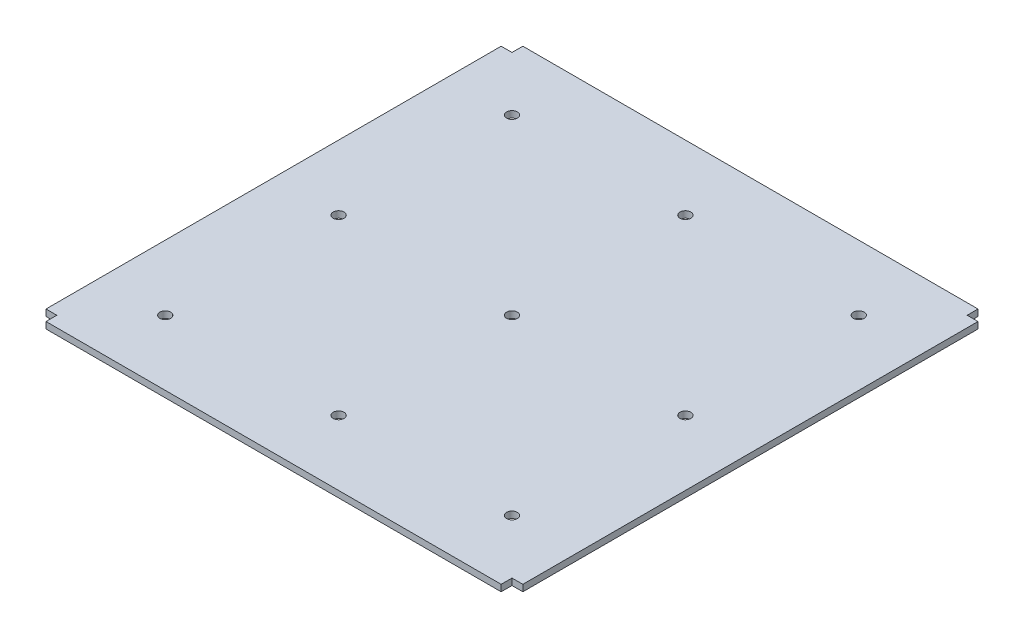
ISO-10303-21;
HEADER;
FILE_DESCRIPTION(('STEP AP214'),'2;1');
FILE_NAME('part.step','',(''),(''),'','','');
FILE_SCHEMA(('AUTOMOTIVE_DESIGN { 1 0 10303 214 1 1 1 1 }'));
ENDSEC;
DATA;
#1=APPLICATION_CONTEXT('core data for automotive mechanical design processes');
#2=APPLICATION_PROTOCOL_DEFINITION('international standard','automotive_design',2000,#1);
#3=PRODUCT_CONTEXT('',#1,'mechanical');
#4=PRODUCT('Part','Part','',(#3));
#5=PRODUCT_RELATED_PRODUCT_CATEGORY('part','',(#4));
#6=PRODUCT_DEFINITION_FORMATION('','',#4);
#7=PRODUCT_DEFINITION_CONTEXT('part definition',#1,'design');
#8=PRODUCT_DEFINITION('design','',#6,#7);
#9=PRODUCT_DEFINITION_SHAPE('','',#8);
#10=(LENGTH_UNIT() NAMED_UNIT(*) SI_UNIT(.MILLI.,.METRE.));
#11=(NAMED_UNIT(*) PLANE_ANGLE_UNIT() SI_UNIT($,.RADIAN.));
#12=(NAMED_UNIT(*) SI_UNIT($,.STERADIAN.) SOLID_ANGLE_UNIT());
#13=UNCERTAINTY_MEASURE_WITH_UNIT(LENGTH_MEASURE(1.E-05),#10,'distance_accuracy_value','');
#14=(GEOMETRIC_REPRESENTATION_CONTEXT(3) GLOBAL_UNCERTAINTY_ASSIGNED_CONTEXT((#13)) GLOBAL_UNIT_ASSIGNED_CONTEXT((#10,
#11,#12)) REPRESENTATION_CONTEXT('',''));
#15=CARTESIAN_POINT('',(0.,0.,0.));
#16=DIRECTION('',(0.,0.,1.));
#17=DIRECTION('',(1.,0.,0.));
#18=AXIS2_PLACEMENT_3D('',#15,#16,#17);
#19=CARTESIAN_POINT('',(0.,3.,-215.));
#20=DIRECTION('',(1.,0.,0.));
#21=DIRECTION('',(0.,0.,-1.));
#22=AXIS2_PLACEMENT_3D('',#19,#20,#21);
#23=PLANE('',#22);
#24=DIRECTION('',(0.,0.,1.));
#25=VECTOR('',#24,1.);
#26=CARTESIAN_POINT('',(0.,0.,-215.));
#27=LINE('',#26,#25);
#28=CARTESIAN_POINT('',(0.,0.,-215.));
#29=VERTEX_POINT('',#28);
#30=CARTESIAN_POINT('',(0.,0.,-210.));
#31=VERTEX_POINT('',#30);
#32=EDGE_CURVE('E157',#29,#31,#27,.T.);
#33=ORIENTED_EDGE('',*,*,#32,.T.);
#34=DIRECTION('',(0.,-1.,0.));
#35=VECTOR('',#34,1.);
#36=CARTESIAN_POINT('',(0.,3.,-210.));
#37=LINE('',#36,#35);
#38=CARTESIAN_POINT('',(0.,3.,-210.));
#39=VERTEX_POINT('',#38);
#40=EDGE_CURVE('E205',#39,#31,#37,.T.);
#41=ORIENTED_EDGE('',*,*,#40,.F.);
#42=DIRECTION('',(0.,0.,1.));
#43=VECTOR('',#42,1.);
#44=CARTESIAN_POINT('',(0.,3.,-215.));
#45=LINE('',#44,#43);
#46=CARTESIAN_POINT('',(0.,3.,-215.));
#47=VERTEX_POINT('',#46);
#48=EDGE_CURVE('E180',#47,#39,#45,.T.);
#49=ORIENTED_EDGE('',*,*,#48,.F.);
#50=DIRECTION('',(0.,-1.,0.));
#51=VECTOR('',#50,1.);
#52=CARTESIAN_POINT('',(0.,3.,-215.));
#53=LINE('',#52,#51);
#54=EDGE_CURVE('E153',#47,#29,#53,.T.);
#55=ORIENTED_EDGE('',*,*,#54,.T.);
#56=EDGE_LOOP('',(#33,#41,#49,#55));
#57=FACE_BOUND('',#56,.T.);
#58=ADVANCED_FACE('F34',(#57),#23,.F.);
#59=CARTESIAN_POINT('',(-5.,3.,-210.));
#60=DIRECTION('',(0.,0.,1.));
#61=DIRECTION('',(1.,0.,0.));
#62=AXIS2_PLACEMENT_3D('',#59,#60,#61);
#63=PLANE('',#62);
#64=DIRECTION('',(-1.,0.,0.));
#65=VECTOR('',#64,1.);
#66=CARTESIAN_POINT('',(-5.,0.,-210.));
#67=LINE('',#66,#65);
#68=CARTESIAN_POINT('',(-5.,0.,-210.));
#69=VERTEX_POINT('',#68);
#70=EDGE_CURVE('E160',#31,#69,#67,.T.);
#71=ORIENTED_EDGE('',*,*,#70,.T.);
#72=DIRECTION('',(0.,-1.,0.));
#73=VECTOR('',#72,1.);
#74=CARTESIAN_POINT('',(-5.,3.,-210.));
#75=LINE('',#74,#73);
#76=CARTESIAN_POINT('',(-5.,3.,-210.));
#77=VERTEX_POINT('',#76);
#78=EDGE_CURVE('E202',#77,#69,#75,.T.);
#79=ORIENTED_EDGE('',*,*,#78,.F.);
#80=DIRECTION('',(-1.,0.,0.));
#81=VECTOR('',#80,1.);
#82=CARTESIAN_POINT('',(-5.,3.,-210.));
#83=LINE('',#82,#81);
#84=EDGE_CURVE('E107',#39,#77,#83,.T.);
#85=ORIENTED_EDGE('',*,*,#84,.F.);
#86=ORIENTED_EDGE('',*,*,#40,.T.);
#87=EDGE_LOOP('',(#71,#79,#85,#86));
#88=FACE_BOUND('',#87,.T.);
#89=ADVANCED_FACE('F268',(#88),#63,.F.);
#90=CARTESIAN_POINT('',(-5.,3.,0.));
#91=DIRECTION('',(1.,0.,0.));
#92=DIRECTION('',(0.,0.,-1.));
#93=AXIS2_PLACEMENT_3D('',#90,#91,#92);
#94=PLANE('',#93);
#95=DIRECTION('',(0.,0.,1.));
#96=VECTOR('',#95,1.);
#97=CARTESIAN_POINT('',(-5.,0.,0.));
#98=LINE('',#97,#96);
#99=CARTESIAN_POINT('',(-5.,0.,0.));
#100=VERTEX_POINT('',#99);
#101=EDGE_CURVE('E163',#69,#100,#98,.T.);
#102=ORIENTED_EDGE('',*,*,#101,.T.);
#103=DIRECTION('',(0.,-1.,0.));
#104=VECTOR('',#103,1.);
#105=CARTESIAN_POINT('',(-5.,3.,0.));
#106=LINE('',#105,#104);
#107=CARTESIAN_POINT('',(-5.,3.,0.));
#108=VERTEX_POINT('',#107);
#109=EDGE_CURVE('E199',#108,#100,#106,.T.);
#110=ORIENTED_EDGE('',*,*,#109,.F.);
#111=DIRECTION('',(0.,0.,1.));
#112=VECTOR('',#111,1.);
#113=CARTESIAN_POINT('',(-5.,3.,0.));
#114=LINE('',#113,#112);
#115=EDGE_CURVE('E502',#77,#108,#114,.T.);
#116=ORIENTED_EDGE('',*,*,#115,.F.);
#117=ORIENTED_EDGE('',*,*,#78,.T.);
#118=EDGE_LOOP('',(#102,#110,#116,#117));
#119=FACE_BOUND('',#118,.T.);
#120=ADVANCED_FACE('F274',(#119),#94,.F.);
#121=CARTESIAN_POINT('',(-5.,3.,0.));
#122=DIRECTION('',(0.,0.,-1.));
#123=DIRECTION('',(-1.,0.,0.));
#124=AXIS2_PLACEMENT_3D('',#121,#122,#123);
#125=PLANE('',#124);
#126=DIRECTION('',(1.,0.,0.));
#127=VECTOR('',#126,1.);
#128=CARTESIAN_POINT('',(-5.,0.,0.));
#129=LINE('',#128,#127);
#130=CARTESIAN_POINT('',(0.,0.,0.));
#131=VERTEX_POINT('',#130);
#132=EDGE_CURVE('E165',#100,#131,#129,.T.);
#133=ORIENTED_EDGE('',*,*,#132,.T.);
#134=DIRECTION('',(0.,-1.,0.));
#135=VECTOR('',#134,1.);
#136=CARTESIAN_POINT('',(0.,3.,0.));
#137=LINE('',#136,#135);
#138=CARTESIAN_POINT('',(0.,3.,0.));
#139=VERTEX_POINT('',#138);
#140=EDGE_CURVE('E196',#139,#131,#137,.T.);
#141=ORIENTED_EDGE('',*,*,#140,.F.);
#142=DIRECTION('',(1.,0.,0.));
#143=VECTOR('',#142,1.);
#144=CARTESIAN_POINT('',(-5.,3.,0.));
#145=LINE('',#144,#143);
#146=EDGE_CURVE('E474',#108,#139,#145,.T.);
#147=ORIENTED_EDGE('',*,*,#146,.F.);
#148=ORIENTED_EDGE('',*,*,#109,.T.);
#149=EDGE_LOOP('',(#133,#141,#147,#148));
#150=FACE_BOUND('',#149,.T.);
#151=ADVANCED_FACE('F429',(#150),#125,.F.);
#152=CARTESIAN_POINT('',(0.,3.,5.));
#153=DIRECTION('',(1.,0.,0.));
#154=DIRECTION('',(0.,0.,-1.));
#155=AXIS2_PLACEMENT_3D('',#152,#153,#154);
#156=PLANE('',#155);
#157=DIRECTION('',(0.,0.,1.));
#158=VECTOR('',#157,1.);
#159=CARTESIAN_POINT('',(0.,0.,5.));
#160=LINE('',#159,#158);
#161=CARTESIAN_POINT('',(0.,0.,5.));
#162=VERTEX_POINT('',#161);
#163=EDGE_CURVE('E167',#131,#162,#160,.T.);
#164=ORIENTED_EDGE('',*,*,#163,.T.);
#165=DIRECTION('',(0.,-1.,0.));
#166=VECTOR('',#165,1.);
#167=CARTESIAN_POINT('',(0.,3.,5.));
#168=LINE('',#167,#166);
#169=CARTESIAN_POINT('',(0.,3.,5.));
#170=VERTEX_POINT('',#169);
#171=EDGE_CURVE('E193',#170,#162,#168,.T.);
#172=ORIENTED_EDGE('',*,*,#171,.F.);
#173=DIRECTION('',(0.,0.,1.));
#174=VECTOR('',#173,1.);
#175=CARTESIAN_POINT('',(0.,3.,5.));
#176=LINE('',#175,#174);
#177=EDGE_CURVE('E487',#139,#170,#176,.T.);
#178=ORIENTED_EDGE('',*,*,#177,.F.);
#179=ORIENTED_EDGE('',*,*,#140,.T.);
#180=EDGE_LOOP('',(#164,#172,#178,#179));
#181=FACE_BOUND('',#180,.T.);
#182=ADVANCED_FACE('F420',(#181),#156,.F.);
#183=CARTESIAN_POINT('',(0.,3.,5.));
#184=DIRECTION('',(0.,0.,-1.));
#185=DIRECTION('',(-1.,0.,0.));
#186=AXIS2_PLACEMENT_3D('',#183,#184,#185);
#187=PLANE('',#186);
#188=DIRECTION('',(1.,0.,0.));
#189=VECTOR('',#188,1.);
#190=CARTESIAN_POINT('',(0.,0.,5.));
#191=LINE('',#190,#189);
#192=CARTESIAN_POINT('',(210.,0.,5.));
#193=VERTEX_POINT('',#192);
#194=EDGE_CURVE('E169',#162,#193,#191,.T.);
#195=ORIENTED_EDGE('',*,*,#194,.T.);
#196=DIRECTION('',(0.,-1.,0.));
#197=VECTOR('',#196,1.);
#198=CARTESIAN_POINT('',(210.,3.,5.));
#199=LINE('',#198,#197);
#200=CARTESIAN_POINT('',(210.,3.,5.));
#201=VERTEX_POINT('',#200);
#202=EDGE_CURVE('E190',#201,#193,#199,.T.);
#203=ORIENTED_EDGE('',*,*,#202,.F.);
#204=DIRECTION('',(1.,0.,0.));
#205=VECTOR('',#204,1.);
#206=CARTESIAN_POINT('',(0.,3.,5.));
#207=LINE('',#206,#205);
#208=EDGE_CURVE('E484',#170,#201,#207,.T.);
#209=ORIENTED_EDGE('',*,*,#208,.F.);
#210=ORIENTED_EDGE('',*,*,#171,.T.);
#211=EDGE_LOOP('',(#195,#203,#209,#210));
#212=FACE_BOUND('',#211,.T.);
#213=ADVANCED_FACE('F411',(#212),#187,.F.);
#214=CARTESIAN_POINT('',(210.,3.,5.));
#215=DIRECTION('',(-1.,0.,0.));
#216=DIRECTION('',(0.,0.,1.));
#217=AXIS2_PLACEMENT_3D('',#214,#215,#216);
#218=PLANE('',#217);
#219=DIRECTION('',(0.,0.,-1.));
#220=VECTOR('',#219,1.);
#221=CARTESIAN_POINT('',(210.,0.,5.));
#222=LINE('',#221,#220);
#223=CARTESIAN_POINT('',(210.,0.,0.));
#224=VERTEX_POINT('',#223);
#225=EDGE_CURVE('E171',#193,#224,#222,.T.);
#226=ORIENTED_EDGE('',*,*,#225,.T.);
#227=DIRECTION('',(0.,-1.,0.));
#228=VECTOR('',#227,1.);
#229=CARTESIAN_POINT('',(210.,3.,0.));
#230=LINE('',#229,#228);
#231=CARTESIAN_POINT('',(210.,3.,0.));
#232=VERTEX_POINT('',#231);
#233=EDGE_CURVE('E187',#232,#224,#230,.T.);
#234=ORIENTED_EDGE('',*,*,#233,.F.);
#235=DIRECTION('',(0.,0.,-1.));
#236=VECTOR('',#235,1.);
#237=CARTESIAN_POINT('',(210.,3.,5.));
#238=LINE('',#237,#236);
#239=EDGE_CURVE('E486',#201,#232,#238,.T.);
#240=ORIENTED_EDGE('',*,*,#239,.F.);
#241=ORIENTED_EDGE('',*,*,#202,.T.);
#242=EDGE_LOOP('',(#226,#234,#240,#241));
#243=FACE_BOUND('',#242,.T.);
#244=ADVANCED_FACE('F402',(#243),#218,.F.);
#245=CARTESIAN_POINT('',(215.,3.,0.));
#246=DIRECTION('',(0.,0.,-1.));
#247=DIRECTION('',(-1.,0.,0.));
#248=AXIS2_PLACEMENT_3D('',#245,#246,#247);
#249=PLANE('',#248);
#250=DIRECTION('',(1.,0.,0.));
#251=VECTOR('',#250,1.);
#252=CARTESIAN_POINT('',(215.,0.,0.));
#253=LINE('',#252,#251);
#254=CARTESIAN_POINT('',(215.,0.,0.));
#255=VERTEX_POINT('',#254);
#256=EDGE_CURVE('E173',#224,#255,#253,.T.);
#257=ORIENTED_EDGE('',*,*,#256,.T.);
#258=DIRECTION('',(0.,-1.,0.));
#259=VECTOR('',#258,1.);
#260=CARTESIAN_POINT('',(215.,3.,0.));
#261=LINE('',#260,#259);
#262=CARTESIAN_POINT('',(215.,3.,0.));
#263=VERTEX_POINT('',#262);
#264=EDGE_CURVE('E184',#263,#255,#261,.T.);
#265=ORIENTED_EDGE('',*,*,#264,.F.);
#266=DIRECTION('',(1.,0.,0.));
#267=VECTOR('',#266,1.);
#268=CARTESIAN_POINT('',(215.,3.,0.));
#269=LINE('',#268,#267);
#270=EDGE_CURVE('E489',#232,#263,#269,.T.);
#271=ORIENTED_EDGE('',*,*,#270,.F.);
#272=ORIENTED_EDGE('',*,*,#233,.T.);
#273=EDGE_LOOP('',(#257,#265,#271,#272));
#274=FACE_BOUND('',#273,.T.);
#275=ADVANCED_FACE('F393',(#274),#249,.F.);
#276=CARTESIAN_POINT('',(215.,3.,0.));
#277=DIRECTION('',(-1.,0.,0.));
#278=DIRECTION('',(0.,0.,1.));
#279=AXIS2_PLACEMENT_3D('',#276,#277,#278);
#280=PLANE('',#279);
#281=DIRECTION('',(0.,0.,-1.));
#282=VECTOR('',#281,1.);
#283=CARTESIAN_POINT('',(215.,0.,0.));
#284=LINE('',#283,#282);
#285=CARTESIAN_POINT('',(215.,0.,-210.));
#286=VERTEX_POINT('',#285);
#287=EDGE_CURVE('E175',#255,#286,#284,.T.);
#288=ORIENTED_EDGE('',*,*,#287,.T.);
#289=DIRECTION('',(0.,-1.,0.));
#290=VECTOR('',#289,1.);
#291=CARTESIAN_POINT('',(215.,3.,-210.));
#292=LINE('',#291,#290);
#293=CARTESIAN_POINT('',(215.,3.,-210.));
#294=VERTEX_POINT('',#293);
#295=EDGE_CURVE('E148',#294,#286,#292,.T.);
#296=ORIENTED_EDGE('',*,*,#295,.F.);
#297=DIRECTION('',(0.,0.,-1.));
#298=VECTOR('',#297,1.);
#299=CARTESIAN_POINT('',(215.,3.,0.));
#300=LINE('',#299,#298);
#301=EDGE_CURVE('E139',#263,#294,#300,.T.);
#302=ORIENTED_EDGE('',*,*,#301,.F.);
#303=ORIENTED_EDGE('',*,*,#264,.T.);
#304=EDGE_LOOP('',(#288,#296,#302,#303));
#305=FACE_BOUND('',#304,.T.);
#306=ADVANCED_FACE('F385',(#305),#280,.F.);
#307=CARTESIAN_POINT('',(215.,3.,-210.));
#308=DIRECTION('',(0.,0.,1.));
#309=DIRECTION('',(1.,0.,0.));
#310=AXIS2_PLACEMENT_3D('',#307,#308,#309);
#311=PLANE('',#310);
#312=DIRECTION('',(-1.,0.,0.));
#313=VECTOR('',#312,1.);
#314=CARTESIAN_POINT('',(215.,0.,-210.));
#315=LINE('',#314,#313);
#316=CARTESIAN_POINT('',(210.,0.,-210.));
#317=VERTEX_POINT('',#316);
#318=EDGE_CURVE('E147',#286,#317,#315,.T.);
#319=ORIENTED_EDGE('',*,*,#318,.T.);
#320=DIRECTION('',(0.,-1.,0.));
#321=VECTOR('',#320,1.);
#322=CARTESIAN_POINT('',(210.,3.,-210.));
#323=LINE('',#322,#321);
#324=CARTESIAN_POINT('',(210.,3.,-210.));
#325=VERTEX_POINT('',#324);
#326=EDGE_CURVE('E144',#325,#317,#323,.T.);
#327=ORIENTED_EDGE('',*,*,#326,.F.);
#328=DIRECTION('',(-1.,0.,0.));
#329=VECTOR('',#328,1.);
#330=CARTESIAN_POINT('',(215.,3.,-210.));
#331=LINE('',#330,#329);
#332=EDGE_CURVE('E132',#294,#325,#331,.T.);
#333=ORIENTED_EDGE('',*,*,#332,.F.);
#334=ORIENTED_EDGE('',*,*,#295,.T.);
#335=EDGE_LOOP('',(#319,#327,#333,#334));
#336=FACE_BOUND('',#335,.T.);
#337=ADVANCED_FACE('F145',(#336),#311,.F.);
#338=CARTESIAN_POINT('',(210.,3.,-215.));
#339=DIRECTION('',(-1.,0.,0.));
#340=DIRECTION('',(0.,0.,1.));
#341=AXIS2_PLACEMENT_3D('',#338,#339,#340);
#342=PLANE('',#341);
#343=DIRECTION('',(0.,0.,-1.));
#344=VECTOR('',#343,1.);
#345=CARTESIAN_POINT('',(210.,0.,-215.));
#346=LINE('',#345,#344);
#347=CARTESIAN_POINT('',(210.,0.,-215.));
#348=VERTEX_POINT('',#347);
#349=EDGE_CURVE('E92',#317,#348,#346,.T.);
#350=ORIENTED_EDGE('',*,*,#349,.T.);
#351=DIRECTION('',(0.,-1.,0.));
#352=VECTOR('',#351,1.);
#353=CARTESIAN_POINT('',(210.,3.,-215.));
#354=LINE('',#353,#352);
#355=CARTESIAN_POINT('',(210.,3.,-215.));
#356=VERTEX_POINT('',#355);
#357=EDGE_CURVE('E149',#356,#348,#354,.T.);
#358=ORIENTED_EDGE('',*,*,#357,.F.);
#359=DIRECTION('',(0.,0.,-1.));
#360=VECTOR('',#359,1.);
#361=CARTESIAN_POINT('',(210.,3.,-215.));
#362=LINE('',#361,#360);
#363=EDGE_CURVE('E137',#325,#356,#362,.T.);
#364=ORIENTED_EDGE('',*,*,#363,.F.);
#365=ORIENTED_EDGE('',*,*,#326,.T.);
#366=EDGE_LOOP('',(#350,#358,#364,#365));
#367=FACE_BOUND('',#366,.T.);
#368=ADVANCED_FACE('F151',(#367),#342,.F.);
#369=CARTESIAN_POINT('',(0.,3.,-215.));
#370=DIRECTION('',(0.,0.,1.));
#371=DIRECTION('',(1.,0.,0.));
#372=AXIS2_PLACEMENT_3D('',#369,#370,#371);
#373=PLANE('',#372);
#374=DIRECTION('',(-1.,0.,0.));
#375=VECTOR('',#374,1.);
#376=CARTESIAN_POINT('',(0.,0.,-215.));
#377=LINE('',#376,#375);
#378=EDGE_CURVE('E98',#348,#29,#377,.T.);
#379=ORIENTED_EDGE('',*,*,#378,.T.);
#380=ORIENTED_EDGE('',*,*,#54,.F.);
#381=DIRECTION('',(-1.,0.,0.));
#382=VECTOR('',#381,1.);
#383=CARTESIAN_POINT('',(0.,3.,-215.));
#384=LINE('',#383,#382);
#385=EDGE_CURVE('E51',#356,#47,#384,.T.);
#386=ORIENTED_EDGE('',*,*,#385,.F.);
#387=ORIENTED_EDGE('',*,*,#357,.T.);
#388=EDGE_LOOP('',(#379,#380,#386,#387));
#389=FACE_BOUND('',#388,.T.);
#390=ADVANCED_FACE('F253',(#389),#373,.F.);
#391=CARTESIAN_POINT('',(0.,3.,0.));
#392=DIRECTION('',(0.,1.,0.));
#393=DIRECTION('',(0.,0.,1.));
#394=AXIS2_PLACEMENT_3D('',#391,#392,#393);
#395=PLANE('',#394);
#396=CARTESIAN_POINT('',(105.,3.,-25.));
#397=DIRECTION('',(0.,1.,0.));
#398=DIRECTION('',(0.,0.,1.));
#399=AXIS2_PLACEMENT_3D('',#396,#397,#398);
#400=CIRCLE('',#399,2.5);
#401=CARTESIAN_POINT('',(105.,3.,-22.5));
#402=VERTEX_POINT('',#401);
#403=EDGE_CURVE('E509',#402,#402,#400,.T.);
#404=ORIENTED_EDGE('',*,*,#403,.F.);
#405=EDGE_LOOP('',(#404));
#406=FACE_BOUND('',#405,.T.);
#407=CARTESIAN_POINT('',(25.,3.,-25.));
#408=DIRECTION('',(0.,1.,0.));
#409=DIRECTION('',(0.,0.,1.));
#410=AXIS2_PLACEMENT_3D('',#407,#408,#409);
#411=CIRCLE('',#410,2.5);
#412=CARTESIAN_POINT('',(25.,3.,-22.5));
#413=VERTEX_POINT('',#412);
#414=EDGE_CURVE('E505',#413,#413,#411,.T.);
#415=ORIENTED_EDGE('',*,*,#414,.F.);
#416=EDGE_LOOP('',(#415));
#417=FACE_BOUND('',#416,.T.);
#418=ORIENTED_EDGE('',*,*,#48,.T.);
#419=ORIENTED_EDGE('',*,*,#84,.T.);
#420=ORIENTED_EDGE('',*,*,#115,.T.);
#421=ORIENTED_EDGE('',*,*,#146,.T.);
#422=ORIENTED_EDGE('',*,*,#177,.T.);
#423=ORIENTED_EDGE('',*,*,#208,.T.);
#424=ORIENTED_EDGE('',*,*,#239,.T.);
#425=ORIENTED_EDGE('',*,*,#270,.T.);
#426=ORIENTED_EDGE('',*,*,#301,.T.);
#427=ORIENTED_EDGE('',*,*,#332,.T.);
#428=ORIENTED_EDGE('',*,*,#363,.T.);
#429=ORIENTED_EDGE('',*,*,#385,.T.);
#430=EDGE_LOOP('',(#418,#419,#420,#421,#422,#423,#424,#425,#426,#427,#428,#429));
#431=FACE_BOUND('',#430,.T.);
#432=CARTESIAN_POINT('',(185.,3.,-25.));
#433=DIRECTION('',(0.,1.,0.));
#434=DIRECTION('',(0.,0.,1.));
#435=AXIS2_PLACEMENT_3D('',#432,#433,#434);
#436=CIRCLE('',#435,2.5);
#437=CARTESIAN_POINT('',(185.,3.,-22.5));
#438=VERTEX_POINT('',#437);
#439=EDGE_CURVE('E210',#438,#438,#436,.T.);
#440=ORIENTED_EDGE('',*,*,#439,.F.);
#441=EDGE_LOOP('',(#440));
#442=FACE_BOUND('',#441,.T.);
#443=CARTESIAN_POINT('',(25.,3.,-105.));
#444=DIRECTION('',(0.,1.,0.));
#445=DIRECTION('',(0.,0.,1.));
#446=AXIS2_PLACEMENT_3D('',#443,#444,#445);
#447=CIRCLE('',#446,2.5);
#448=CARTESIAN_POINT('',(25.,3.,-102.5));
#449=VERTEX_POINT('',#448);
#450=EDGE_CURVE('E216',#449,#449,#447,.T.);
#451=ORIENTED_EDGE('',*,*,#450,.F.);
#452=EDGE_LOOP('',(#451));
#453=FACE_BOUND('',#452,.T.);
#454=CARTESIAN_POINT('',(105.,3.,-105.));
#455=DIRECTION('',(0.,1.,0.));
#456=DIRECTION('',(0.,0.,1.));
#457=AXIS2_PLACEMENT_3D('',#454,#455,#456);
#458=CIRCLE('',#457,2.5);
#459=CARTESIAN_POINT('',(105.,3.,-102.5));
#460=VERTEX_POINT('',#459);
#461=EDGE_CURVE('E222',#460,#460,#458,.T.);
#462=ORIENTED_EDGE('',*,*,#461,.F.);
#463=EDGE_LOOP('',(#462));
#464=FACE_BOUND('',#463,.T.);
#465=CARTESIAN_POINT('',(185.,3.,-105.));
#466=DIRECTION('',(0.,1.,0.));
#467=DIRECTION('',(0.,0.,1.));
#468=AXIS2_PLACEMENT_3D('',#465,#466,#467);
#469=CIRCLE('',#468,2.5);
#470=CARTESIAN_POINT('',(185.,3.,-102.5));
#471=VERTEX_POINT('',#470);
#472=EDGE_CURVE('E228',#471,#471,#469,.T.);
#473=ORIENTED_EDGE('',*,*,#472,.F.);
#474=EDGE_LOOP('',(#473));
#475=FACE_BOUND('',#474,.T.);
#476=CARTESIAN_POINT('',(25.,3.,-185.));
#477=DIRECTION('',(0.,1.,0.));
#478=DIRECTION('',(0.,0.,1.));
#479=AXIS2_PLACEMENT_3D('',#476,#477,#478);
#480=CIRCLE('',#479,2.5);
#481=CARTESIAN_POINT('',(25.,3.,-182.5));
#482=VERTEX_POINT('',#481);
#483=EDGE_CURVE('E234',#482,#482,#480,.T.);
#484=ORIENTED_EDGE('',*,*,#483,.F.);
#485=EDGE_LOOP('',(#484));
#486=FACE_BOUND('',#485,.T.);
#487=CARTESIAN_POINT('',(105.,3.,-185.));
#488=DIRECTION('',(0.,1.,0.));
#489=DIRECTION('',(0.,0.,1.));
#490=AXIS2_PLACEMENT_3D('',#487,#488,#489);
#491=CIRCLE('',#490,2.5);
#492=CARTESIAN_POINT('',(105.,3.,-182.5));
#493=VERTEX_POINT('',#492);
#494=EDGE_CURVE('E240',#493,#493,#491,.T.);
#495=ORIENTED_EDGE('',*,*,#494,.F.);
#496=EDGE_LOOP('',(#495));
#497=FACE_BOUND('',#496,.T.);
#498=CARTESIAN_POINT('',(185.,3.,-185.));
#499=DIRECTION('',(0.,1.,0.));
#500=DIRECTION('',(0.,0.,1.));
#501=AXIS2_PLACEMENT_3D('',#498,#499,#500);
#502=CIRCLE('',#501,2.5);
#503=CARTESIAN_POINT('',(185.,3.,-182.5));
#504=VERTEX_POINT('',#503);
#505=EDGE_CURVE('E11',#504,#504,#502,.T.);
#506=ORIENTED_EDGE('',*,*,#505,.F.);
#507=EDGE_LOOP('',(#506));
#508=FACE_BOUND('',#507,.T.);
#509=ADVANCED_FACE('F134',(#406,#417,#431,#442,#453,#464,#475,#486,#497,#508),#395,.T.);
#510=CARTESIAN_POINT('',(0.,0.,0.));
#511=DIRECTION('',(0.,1.,0.));
#512=DIRECTION('',(0.,0.,1.));
#513=AXIS2_PLACEMENT_3D('',#510,#511,#512);
#514=PLANE('',#513);
#515=CARTESIAN_POINT('',(105.,0.,-25.));
#516=DIRECTION('',(0.,1.,0.));
#517=DIRECTION('',(0.,0.,1.));
#518=AXIS2_PLACEMENT_3D('',#515,#516,#517);
#519=CIRCLE('',#518,2.5);
#520=CARTESIAN_POINT('',(105.,0.,-22.5));
#521=VERTEX_POINT('',#520);
#522=EDGE_CURVE('E514',#521,#521,#519,.T.);
#523=ORIENTED_EDGE('',*,*,#522,.T.);
#524=EDGE_LOOP('',(#523));
#525=FACE_BOUND('',#524,.T.);
#526=CARTESIAN_POINT('',(25.,0.,-25.));
#527=DIRECTION('',(0.,1.,0.));
#528=DIRECTION('',(0.,0.,1.));
#529=AXIS2_PLACEMENT_3D('',#526,#527,#528);
#530=CIRCLE('',#529,2.5);
#531=CARTESIAN_POINT('',(25.,0.,-22.5));
#532=VERTEX_POINT('',#531);
#533=EDGE_CURVE('E161',#532,#532,#530,.T.);
#534=ORIENTED_EDGE('',*,*,#533,.T.);
#535=EDGE_LOOP('',(#534));
#536=FACE_BOUND('',#535,.T.);
#537=ORIENTED_EDGE('',*,*,#32,.F.);
#538=ORIENTED_EDGE('',*,*,#378,.F.);
#539=ORIENTED_EDGE('',*,*,#349,.F.);
#540=ORIENTED_EDGE('',*,*,#318,.F.);
#541=ORIENTED_EDGE('',*,*,#287,.F.);
#542=ORIENTED_EDGE('',*,*,#256,.F.);
#543=ORIENTED_EDGE('',*,*,#225,.F.);
#544=ORIENTED_EDGE('',*,*,#194,.F.);
#545=ORIENTED_EDGE('',*,*,#163,.F.);
#546=ORIENTED_EDGE('',*,*,#132,.F.);
#547=ORIENTED_EDGE('',*,*,#101,.F.);
#548=ORIENTED_EDGE('',*,*,#70,.F.);
#549=EDGE_LOOP('',(#537,#538,#539,#540,#541,#542,#543,#544,#545,#546,#547,#548));
#550=FACE_BOUND('',#549,.T.);
#551=CARTESIAN_POINT('',(185.,0.,-25.));
#552=DIRECTION('',(0.,1.,0.));
#553=DIRECTION('',(0.,0.,1.));
#554=AXIS2_PLACEMENT_3D('',#551,#552,#553);
#555=CIRCLE('',#554,2.5);
#556=CARTESIAN_POINT('',(185.,0.,-22.5));
#557=VERTEX_POINT('',#556);
#558=EDGE_CURVE('E207',#557,#557,#555,.T.);
#559=ORIENTED_EDGE('',*,*,#558,.T.);
#560=EDGE_LOOP('',(#559));
#561=FACE_BOUND('',#560,.T.);
#562=CARTESIAN_POINT('',(25.,0.,-105.));
#563=DIRECTION('',(0.,1.,0.));
#564=DIRECTION('',(0.,0.,1.));
#565=AXIS2_PLACEMENT_3D('',#562,#563,#564);
#566=CIRCLE('',#565,2.5);
#567=CARTESIAN_POINT('',(25.,0.,-102.5));
#568=VERTEX_POINT('',#567);
#569=EDGE_CURVE('E213',#568,#568,#566,.T.);
#570=ORIENTED_EDGE('',*,*,#569,.T.);
#571=EDGE_LOOP('',(#570));
#572=FACE_BOUND('',#571,.T.);
#573=CARTESIAN_POINT('',(105.,0.,-105.));
#574=DIRECTION('',(0.,1.,0.));
#575=DIRECTION('',(0.,0.,1.));
#576=AXIS2_PLACEMENT_3D('',#573,#574,#575);
#577=CIRCLE('',#576,2.5);
#578=CARTESIAN_POINT('',(105.,0.,-102.5));
#579=VERTEX_POINT('',#578);
#580=EDGE_CURVE('E219',#579,#579,#577,.T.);
#581=ORIENTED_EDGE('',*,*,#580,.T.);
#582=EDGE_LOOP('',(#581));
#583=FACE_BOUND('',#582,.T.);
#584=CARTESIAN_POINT('',(185.,0.,-105.));
#585=DIRECTION('',(0.,1.,0.));
#586=DIRECTION('',(0.,0.,1.));
#587=AXIS2_PLACEMENT_3D('',#584,#585,#586);
#588=CIRCLE('',#587,2.5);
#589=CARTESIAN_POINT('',(185.,0.,-102.5));
#590=VERTEX_POINT('',#589);
#591=EDGE_CURVE('E225',#590,#590,#588,.T.);
#592=ORIENTED_EDGE('',*,*,#591,.T.);
#593=EDGE_LOOP('',(#592));
#594=FACE_BOUND('',#593,.T.);
#595=CARTESIAN_POINT('',(25.,0.,-185.));
#596=DIRECTION('',(0.,1.,0.));
#597=DIRECTION('',(0.,0.,1.));
#598=AXIS2_PLACEMENT_3D('',#595,#596,#597);
#599=CIRCLE('',#598,2.5);
#600=CARTESIAN_POINT('',(25.,0.,-182.5));
#601=VERTEX_POINT('',#600);
#602=EDGE_CURVE('E231',#601,#601,#599,.T.);
#603=ORIENTED_EDGE('',*,*,#602,.T.);
#604=EDGE_LOOP('',(#603));
#605=FACE_BOUND('',#604,.T.);
#606=CARTESIAN_POINT('',(105.,0.,-185.));
#607=DIRECTION('',(0.,1.,0.));
#608=DIRECTION('',(0.,0.,1.));
#609=AXIS2_PLACEMENT_3D('',#606,#607,#608);
#610=CIRCLE('',#609,2.5);
#611=CARTESIAN_POINT('',(105.,0.,-182.5));
#612=VERTEX_POINT('',#611);
#613=EDGE_CURVE('E237',#612,#612,#610,.T.);
#614=ORIENTED_EDGE('',*,*,#613,.T.);
#615=EDGE_LOOP('',(#614));
#616=FACE_BOUND('',#615,.T.);
#617=CARTESIAN_POINT('',(185.,0.,-185.));
#618=DIRECTION('',(0.,1.,0.));
#619=DIRECTION('',(0.,0.,1.));
#620=AXIS2_PLACEMENT_3D('',#617,#618,#619);
#621=CIRCLE('',#620,2.5);
#622=CARTESIAN_POINT('',(185.,0.,-182.5));
#623=VERTEX_POINT('',#622);
#624=EDGE_CURVE('E43',#623,#623,#621,.T.);
#625=ORIENTED_EDGE('',*,*,#624,.T.);
#626=EDGE_LOOP('',(#625));
#627=FACE_BOUND('',#626,.T.);
#628=ADVANCED_FACE('F245',(#525,#536,#550,#561,#572,#583,#594,#605,#616,#627),#514,.F.);
#629=CARTESIAN_POINT('',(25.,0.,-25.));
#630=DIRECTION('',(0.,1.,0.));
#631=DIRECTION('',(0.,0.,1.));
#632=AXIS2_PLACEMENT_3D('',#629,#630,#631);
#633=CYLINDRICAL_SURFACE('',#632,2.5);
#634=ORIENTED_EDGE('',*,*,#533,.F.);
#635=EDGE_LOOP('',(#634));
#636=FACE_BOUND('',#635,.T.);
#637=ORIENTED_EDGE('',*,*,#414,.T.);
#638=EDGE_LOOP('',(#637));
#639=FACE_BOUND('',#638,.T.);
#640=ADVANCED_FACE('F260',(#636,#639),#633,.F.);
#641=CARTESIAN_POINT('',(105.,0.,-25.));
#642=DIRECTION('',(0.,1.,0.));
#643=DIRECTION('',(0.,0.,1.));
#644=AXIS2_PLACEMENT_3D('',#641,#642,#643);
#645=CYLINDRICAL_SURFACE('',#644,2.5);
#646=ORIENTED_EDGE('',*,*,#522,.F.);
#647=EDGE_LOOP('',(#646));
#648=FACE_BOUND('',#647,.T.);
#649=ORIENTED_EDGE('',*,*,#403,.T.);
#650=EDGE_LOOP('',(#649));
#651=FACE_BOUND('',#650,.T.);
#652=ADVANCED_FACE('F282',(#648,#651),#645,.F.);
#653=CARTESIAN_POINT('',(185.,0.,-25.));
#654=DIRECTION('',(0.,1.,0.));
#655=DIRECTION('',(0.,0.,1.));
#656=AXIS2_PLACEMENT_3D('',#653,#654,#655);
#657=CYLINDRICAL_SURFACE('',#656,2.5);
#658=ORIENTED_EDGE('',*,*,#558,.F.);
#659=EDGE_LOOP('',(#658));
#660=FACE_BOUND('',#659,.T.);
#661=ORIENTED_EDGE('',*,*,#439,.T.);
#662=EDGE_LOOP('',(#661));
#663=FACE_BOUND('',#662,.T.);
#664=ADVANCED_FACE('F278',(#660,#663),#657,.F.);
#665=CARTESIAN_POINT('',(25.,0.,-105.));
#666=DIRECTION('',(0.,1.,0.));
#667=DIRECTION('',(0.,0.,1.));
#668=AXIS2_PLACEMENT_3D('',#665,#666,#667);
#669=CYLINDRICAL_SURFACE('',#668,2.5);
#670=ORIENTED_EDGE('',*,*,#569,.F.);
#671=EDGE_LOOP('',(#670));
#672=FACE_BOUND('',#671,.T.);
#673=ORIENTED_EDGE('',*,*,#450,.T.);
#674=EDGE_LOOP('',(#673));
#675=FACE_BOUND('',#674,.T.);
#676=ADVANCED_FACE('F281',(#672,#675),#669,.F.);
#677=CARTESIAN_POINT('',(105.,0.,-105.));
#678=DIRECTION('',(0.,1.,0.));
#679=DIRECTION('',(0.,0.,1.));
#680=AXIS2_PLACEMENT_3D('',#677,#678,#679);
#681=CYLINDRICAL_SURFACE('',#680,2.5);
#682=ORIENTED_EDGE('',*,*,#580,.F.);
#683=EDGE_LOOP('',(#682));
#684=FACE_BOUND('',#683,.T.);
#685=ORIENTED_EDGE('',*,*,#461,.T.);
#686=EDGE_LOOP('',(#685));
#687=FACE_BOUND('',#686,.T.);
#688=ADVANCED_FACE('F286',(#684,#687),#681,.F.);
#689=CARTESIAN_POINT('',(185.,0.,-105.));
#690=DIRECTION('',(0.,1.,0.));
#691=DIRECTION('',(0.,0.,1.));
#692=AXIS2_PLACEMENT_3D('',#689,#690,#691);
#693=CYLINDRICAL_SURFACE('',#692,2.5);
#694=ORIENTED_EDGE('',*,*,#591,.F.);
#695=EDGE_LOOP('',(#694));
#696=FACE_BOUND('',#695,.T.);
#697=ORIENTED_EDGE('',*,*,#472,.T.);
#698=EDGE_LOOP('',(#697));
#699=FACE_BOUND('',#698,.T.);
#700=ADVANCED_FACE('F290',(#696,#699),#693,.F.);
#701=CARTESIAN_POINT('',(25.,0.,-185.));
#702=DIRECTION('',(0.,1.,0.));
#703=DIRECTION('',(0.,0.,1.));
#704=AXIS2_PLACEMENT_3D('',#701,#702,#703);
#705=CYLINDRICAL_SURFACE('',#704,2.5);
#706=ORIENTED_EDGE('',*,*,#602,.F.);
#707=EDGE_LOOP('',(#706));
#708=FACE_BOUND('',#707,.T.);
#709=ORIENTED_EDGE('',*,*,#483,.T.);
#710=EDGE_LOOP('',(#709));
#711=FACE_BOUND('',#710,.T.);
#712=ADVANCED_FACE('F294',(#708,#711),#705,.F.);
#713=CARTESIAN_POINT('',(105.,0.,-185.));
#714=DIRECTION('',(0.,1.,0.));
#715=DIRECTION('',(0.,0.,1.));
#716=AXIS2_PLACEMENT_3D('',#713,#714,#715);
#717=CYLINDRICAL_SURFACE('',#716,2.5);
#718=ORIENTED_EDGE('',*,*,#613,.F.);
#719=EDGE_LOOP('',(#718));
#720=FACE_BOUND('',#719,.T.);
#721=ORIENTED_EDGE('',*,*,#494,.T.);
#722=EDGE_LOOP('',(#721));
#723=FACE_BOUND('',#722,.T.);
#724=ADVANCED_FACE('F249',(#720,#723),#717,.F.);
#725=CARTESIAN_POINT('',(185.,0.,-185.));
#726=DIRECTION('',(0.,1.,0.));
#727=DIRECTION('',(0.,0.,1.));
#728=AXIS2_PLACEMENT_3D('',#725,#726,#727);
#729=CYLINDRICAL_SURFACE('',#728,2.5);
#730=ORIENTED_EDGE('',*,*,#624,.F.);
#731=EDGE_LOOP('',(#730));
#732=FACE_BOUND('',#731,.T.);
#733=ORIENTED_EDGE('',*,*,#505,.T.);
#734=EDGE_LOOP('',(#733));
#735=FACE_BOUND('',#734,.T.);
#736=ADVANCED_FACE('F36',(#732,#735),#729,.F.);
#737=CLOSED_SHELL('',(#58,#89,#120,#151,#182,#213,#244,#275,#306,#337,#368,#390,#509,#628,#640,
#652,#664,#676,#688,#700,#712,#724,#736));
#738=MANIFOLD_SOLID_BREP('B2',#737);
#739=ADVANCED_BREP_SHAPE_REPRESENTATION('',(#18,#738),#14);
#740=SHAPE_DEFINITION_REPRESENTATION(#9,#739);
ENDSEC;
END-ISO-10303-21;
